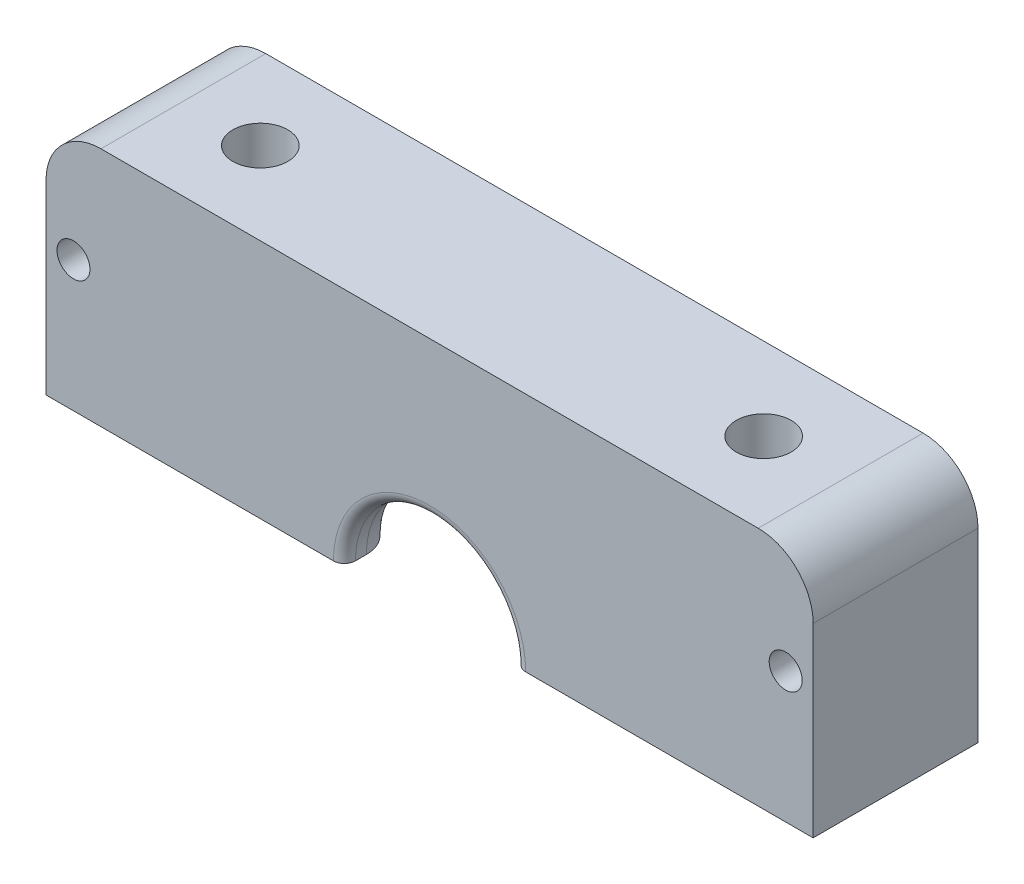
ISO-10303-21;
HEADER;
FILE_DESCRIPTION(('STEP AP214'),'2;1');
FILE_NAME('part.step','',(''),(''),'','','');
FILE_SCHEMA(('AUTOMOTIVE_DESIGN { 1 0 10303 214 1 1 1 1 }'));
ENDSEC;
DATA;
#1=APPLICATION_CONTEXT('core data for automotive mechanical design processes');
#2=APPLICATION_PROTOCOL_DEFINITION('international standard','automotive_design',2000,#1);
#3=PRODUCT_CONTEXT('',#1,'mechanical');
#4=PRODUCT('Part','Part','',(#3));
#5=PRODUCT_RELATED_PRODUCT_CATEGORY('part','',(#4));
#6=PRODUCT_DEFINITION_FORMATION('','',#4);
#7=PRODUCT_DEFINITION_CONTEXT('part definition',#1,'design');
#8=PRODUCT_DEFINITION('design','',#6,#7);
#9=PRODUCT_DEFINITION_SHAPE('','',#8);
#10=(LENGTH_UNIT() NAMED_UNIT(*) SI_UNIT(.MILLI.,.METRE.));
#11=(NAMED_UNIT(*) PLANE_ANGLE_UNIT() SI_UNIT($,.RADIAN.));
#12=(NAMED_UNIT(*) SI_UNIT($,.STERADIAN.) SOLID_ANGLE_UNIT());
#13=UNCERTAINTY_MEASURE_WITH_UNIT(LENGTH_MEASURE(1.E-05),#10,'distance_accuracy_value','');
#14=(GEOMETRIC_REPRESENTATION_CONTEXT(3) GLOBAL_UNCERTAINTY_ASSIGNED_CONTEXT((#13)) GLOBAL_UNIT_ASSIGNED_CONTEXT((#10,
#11,#12)) REPRESENTATION_CONTEXT('',''));
#15=CARTESIAN_POINT('',(0.,0.,0.));
#16=DIRECTION('',(0.,0.,1.));
#17=DIRECTION('',(1.,0.,0.));
#18=AXIS2_PLACEMENT_3D('',#15,#16,#17);
#19=CARTESIAN_POINT('',(34.9,16.9,15.));
#20=DIRECTION('',(-1.,0.,0.));
#21=DIRECTION('',(0.,-1.,0.));
#22=AXIS2_PLACEMENT_3D('',#19,#20,#21);
#23=PLANE('',#22);
#24=DIRECTION('',(0.,1.,0.));
#25=VECTOR('',#24,1.);
#26=CARTESIAN_POINT('',(34.9,16.9,15.));
#27=LINE('',#26,#25);
#28=CARTESIAN_POINT('',(34.9,0.,15.));
#29=VERTEX_POINT('',#28);
#30=CARTESIAN_POINT('',(34.9,16.9,15.));
#31=VERTEX_POINT('',#30);
#32=EDGE_CURVE('E153',#29,#31,#27,.T.);
#33=ORIENTED_EDGE('',*,*,#32,.F.);
#34=DIRECTION('',(0.,0.,-1.));
#35=VECTOR('',#34,1.);
#36=CARTESIAN_POINT('',(34.9,0.,15.));
#37=LINE('',#36,#35);
#38=CARTESIAN_POINT('',(34.9,0.,0.));
#39=VERTEX_POINT('',#38);
#40=EDGE_CURVE('E135',#29,#39,#37,.T.);
#41=ORIENTED_EDGE('',*,*,#40,.T.);
#42=DIRECTION('',(0.,1.,0.));
#43=VECTOR('',#42,1.);
#44=CARTESIAN_POINT('',(34.9,16.9,0.));
#45=LINE('',#44,#43);
#46=CARTESIAN_POINT('',(34.9,16.9,0.));
#47=VERTEX_POINT('',#46);
#48=EDGE_CURVE('E181',#39,#47,#45,.T.);
#49=ORIENTED_EDGE('',*,*,#48,.T.);
#50=DIRECTION('',(0.,0.,-1.));
#51=VECTOR('',#50,1.);
#52=CARTESIAN_POINT('',(34.9,16.9,15.));
#53=LINE('',#52,#51);
#54=EDGE_CURVE('E160',#31,#47,#53,.T.);
#55=ORIENTED_EDGE('',*,*,#54,.F.);
#56=EDGE_LOOP('',(#33,#41,#49,#55));
#57=FACE_BOUND('',#56,.T.);
#58=ADVANCED_FACE('F37',(#57),#23,.F.);
#59=CARTESIAN_POINT('',(29.9,16.9,15.));
#60=DIRECTION('',(0.,0.,-1.));
#61=DIRECTION('',(-1.,0.,0.));
#62=AXIS2_PLACEMENT_3D('',#59,#60,#61);
#63=CYLINDRICAL_SURFACE('',#62,5.);
#64=CARTESIAN_POINT('',(29.9,16.9,0.));
#65=DIRECTION('',(0.,0.,1.));
#66=DIRECTION('',(-1.,0.,0.));
#67=AXIS2_PLACEMENT_3D('',#64,#65,#66);
#68=CIRCLE('',#67,5.);
#69=CARTESIAN_POINT('',(29.9,21.9,0.));
#70=VERTEX_POINT('',#69);
#71=EDGE_CURVE('E183',#47,#70,#68,.T.);
#72=ORIENTED_EDGE('',*,*,#71,.T.);
#73=DIRECTION('',(0.,0.,-1.));
#74=VECTOR('',#73,1.);
#75=CARTESIAN_POINT('',(29.9,21.9,15.));
#76=LINE('',#75,#74);
#77=CARTESIAN_POINT('',(29.9,21.9,15.));
#78=VERTEX_POINT('',#77);
#79=EDGE_CURVE('E194',#78,#70,#76,.T.);
#80=ORIENTED_EDGE('',*,*,#79,.F.);
#81=CARTESIAN_POINT('',(29.9,16.9,15.));
#82=DIRECTION('',(0.,0.,1.));
#83=DIRECTION('',(-1.,0.,0.));
#84=AXIS2_PLACEMENT_3D('',#81,#82,#83);
#85=CIRCLE('',#84,5.);
#86=EDGE_CURVE('E162',#31,#78,#85,.T.);
#87=ORIENTED_EDGE('',*,*,#86,.F.);
#88=ORIENTED_EDGE('',*,*,#54,.T.);
#89=EDGE_LOOP('',(#72,#80,#87,#88));
#90=FACE_BOUND('',#89,.T.);
#91=ADVANCED_FACE('F257',(#90),#63,.T.);
#92=CARTESIAN_POINT('',(-29.9,21.9,15.));
#93=DIRECTION('',(0.,-1.,0.));
#94=DIRECTION('',(0.,0.,-1.));
#95=AXIS2_PLACEMENT_3D('',#92,#93,#94);
#96=PLANE('',#95);
#97=CARTESIAN_POINT('',(-22.9,21.9,7.5));
#98=DIRECTION('',(0.,1.,0.));
#99=DIRECTION('',(0.,0.,1.));
#100=AXIS2_PLACEMENT_3D('',#97,#98,#99);
#101=CIRCLE('',#100,2.5);
#102=CARTESIAN_POINT('',(-22.9,21.9,10.));
#103=VERTEX_POINT('',#102);
#104=EDGE_CURVE('E333',#103,#103,#101,.T.);
#105=ORIENTED_EDGE('',*,*,#104,.F.);
#106=EDGE_LOOP('',(#105));
#107=FACE_BOUND('',#106,.T.);
#108=CARTESIAN_POINT('',(22.9,21.9,7.50000000000011));
#109=DIRECTION('',(0.,1.,0.));
#110=DIRECTION('',(0.,0.,-1.));
#111=AXIS2_PLACEMENT_3D('',#108,#109,#110);
#112=CIRCLE('',#111,2.5);
#113=CARTESIAN_POINT('',(22.9,21.9,5.0000000000001));
#114=VERTEX_POINT('',#113);
#115=EDGE_CURVE('E337',#114,#114,#112,.T.);
#116=ORIENTED_EDGE('',*,*,#115,.F.);
#117=EDGE_LOOP('',(#116));
#118=FACE_BOUND('',#117,.T.);
#119=DIRECTION('',(-1.,0.,0.));
#120=VECTOR('',#119,1.);
#121=CARTESIAN_POINT('',(-29.9,21.9,0.));
#122=LINE('',#121,#120);
#123=CARTESIAN_POINT('',(-29.9,21.9,0.));
#124=VERTEX_POINT('',#123);
#125=EDGE_CURVE('E186',#70,#124,#122,.T.);
#126=ORIENTED_EDGE('',*,*,#125,.T.);
#127=DIRECTION('',(0.,0.,-1.));
#128=VECTOR('',#127,1.);
#129=CARTESIAN_POINT('',(-29.9,21.9,15.));
#130=LINE('',#129,#128);
#131=CARTESIAN_POINT('',(-29.9,21.9,15.));
#132=VERTEX_POINT('',#131);
#133=EDGE_CURVE('E191',#132,#124,#130,.T.);
#134=ORIENTED_EDGE('',*,*,#133,.F.);
#135=DIRECTION('',(-1.,0.,0.));
#136=VECTOR('',#135,1.);
#137=CARTESIAN_POINT('',(-29.9,21.9,15.));
#138=LINE('',#137,#136);
#139=EDGE_CURVE('E165',#78,#132,#138,.T.);
#140=ORIENTED_EDGE('',*,*,#139,.F.);
#141=ORIENTED_EDGE('',*,*,#79,.T.);
#142=EDGE_LOOP('',(#126,#134,#140,#141));
#143=FACE_BOUND('',#142,.T.);
#144=ADVANCED_FACE('F262',(#107,#118,#143),#96,.F.);
#145=CARTESIAN_POINT('',(-29.9,16.9,15.));
#146=DIRECTION('',(0.,0.,-1.));
#147=DIRECTION('',(-1.,0.,0.));
#148=AXIS2_PLACEMENT_3D('',#145,#146,#147);
#149=CYLINDRICAL_SURFACE('',#148,5.);
#150=CARTESIAN_POINT('',(-29.9,16.9,0.));
#151=DIRECTION('',(0.,0.,1.));
#152=DIRECTION('',(1.,0.,0.));
#153=AXIS2_PLACEMENT_3D('',#150,#151,#152);
#154=CIRCLE('',#153,5.);
#155=CARTESIAN_POINT('',(-34.9,16.9,0.));
#156=VERTEX_POINT('',#155);
#157=EDGE_CURVE('E168',#124,#156,#154,.T.);
#158=ORIENTED_EDGE('',*,*,#157,.T.);
#159=DIRECTION('',(0.,0.,-1.));
#160=VECTOR('',#159,1.);
#161=CARTESIAN_POINT('',(-34.9,16.9,15.));
#162=LINE('',#161,#160);
#163=CARTESIAN_POINT('',(-34.9,16.9,15.));
#164=VERTEX_POINT('',#163);
#165=EDGE_CURVE('E180',#164,#156,#162,.T.);
#166=ORIENTED_EDGE('',*,*,#165,.F.);
#167=CARTESIAN_POINT('',(-29.9,16.9,15.));
#168=DIRECTION('',(0.,0.,1.));
#169=DIRECTION('',(1.,0.,0.));
#170=AXIS2_PLACEMENT_3D('',#167,#168,#169);
#171=CIRCLE('',#170,5.);
#172=EDGE_CURVE('E175',#132,#164,#171,.T.);
#173=ORIENTED_EDGE('',*,*,#172,.F.);
#174=ORIENTED_EDGE('',*,*,#133,.T.);
#175=EDGE_LOOP('',(#158,#166,#173,#174));
#176=FACE_BOUND('',#175,.T.);
#177=ADVANCED_FACE('F318',(#176),#149,.T.);
#178=CARTESIAN_POINT('',(-34.9,16.9,15.));
#179=DIRECTION('',(1.,0.,0.));
#180=DIRECTION('',(0.,1.,0.));
#181=AXIS2_PLACEMENT_3D('',#178,#179,#180);
#182=PLANE('',#181);
#183=DIRECTION('',(0.,-1.,0.));
#184=VECTOR('',#183,1.);
#185=CARTESIAN_POINT('',(-34.9,16.9,0.));
#186=LINE('',#185,#184);
#187=CARTESIAN_POINT('',(-34.9,0.,0.));
#188=VERTEX_POINT('',#187);
#189=EDGE_CURVE('E163',#156,#188,#186,.T.);
#190=ORIENTED_EDGE('',*,*,#189,.T.);
#191=DIRECTION('',(0.,0.,1.));
#192=VECTOR('',#191,1.);
#193=CARTESIAN_POINT('',(-34.9,0.,15.));
#194=LINE('',#193,#192);
#195=CARTESIAN_POINT('',(-34.9,0.,15.));
#196=VERTEX_POINT('',#195);
#197=EDGE_CURVE('E147',#188,#196,#194,.T.);
#198=ORIENTED_EDGE('',*,*,#197,.T.);
#199=DIRECTION('',(0.,-1.,0.));
#200=VECTOR('',#199,1.);
#201=CARTESIAN_POINT('',(-34.9,16.9,15.));
#202=LINE('',#201,#200);
#203=EDGE_CURVE('E177',#164,#196,#202,.T.);
#204=ORIENTED_EDGE('',*,*,#203,.F.);
#205=ORIENTED_EDGE('',*,*,#165,.T.);
#206=EDGE_LOOP('',(#190,#198,#204,#205));
#207=FACE_BOUND('',#206,.T.);
#208=ADVANCED_FACE('F310',(#207),#182,.F.);
#209=CARTESIAN_POINT('',(-29.9,-16.9,15.));
#210=DIRECTION('',(0.,0.,1.));
#211=DIRECTION('',(1.,0.,0.));
#212=AXIS2_PLACEMENT_3D('',#209,#210,#211);
#213=PLANE('',#212);
#214=DIRECTION('',(-1.,0.,0.));
#215=VECTOR('',#214,1.);
#216=CARTESIAN_POINT('',(-43.4263275089978,0.,15.));
#217=LINE('',#216,#215);
#218=CARTESIAN_POINT('',(-8.75,0.,15.));
#219=VERTEX_POINT('',#218);
#220=EDGE_CURVE('E157',#219,#196,#217,.T.);
#221=ORIENTED_EDGE('',*,*,#220,.F.);
#222=CARTESIAN_POINT('',(0.,0.,15.));
#223=DIRECTION('',(0.,0.,1.));
#224=DIRECTION('',(1.,0.,0.));
#225=AXIS2_PLACEMENT_3D('',#222,#223,#224);
#226=CIRCLE('',#225,8.75);
#227=CARTESIAN_POINT('',(8.75,0.,15.));
#228=VERTEX_POINT('',#227);
#229=EDGE_CURVE('E156',#219,#228,#226,.F.);
#230=ORIENTED_EDGE('',*,*,#229,.T.);
#231=EDGE_CURVE('E139',#29,#228,#217,.T.);
#232=ORIENTED_EDGE('',*,*,#231,.F.);
#233=ORIENTED_EDGE('',*,*,#32,.T.);
#234=ORIENTED_EDGE('',*,*,#86,.T.);
#235=ORIENTED_EDGE('',*,*,#139,.T.);
#236=ORIENTED_EDGE('',*,*,#172,.T.);
#237=ORIENTED_EDGE('',*,*,#203,.T.);
#238=EDGE_LOOP('',(#221,#230,#232,#233,#234,#235,#236,#237));
#239=FACE_BOUND('',#238,.T.);
#240=CARTESIAN_POINT('',(32.4,11.9,15.));
#241=DIRECTION('',(0.,0.,1.));
#242=DIRECTION('',(-1.,0.,0.));
#243=AXIS2_PLACEMENT_3D('',#240,#241,#242);
#244=CIRCLE('',#243,1.5);
#245=CARTESIAN_POINT('',(30.9,11.9,15.));
#246=VERTEX_POINT('',#245);
#247=EDGE_CURVE('E296',#246,#246,#244,.T.);
#248=ORIENTED_EDGE('',*,*,#247,.F.);
#249=EDGE_LOOP('',(#248));
#250=FACE_BOUND('',#249,.T.);
#251=CARTESIAN_POINT('',(-32.4,11.9,15.));
#252=DIRECTION('',(0.,0.,1.));
#253=DIRECTION('',(1.,0.,0.));
#254=AXIS2_PLACEMENT_3D('',#251,#252,#253);
#255=CIRCLE('',#254,1.5);
#256=CARTESIAN_POINT('',(-30.9,11.9,15.));
#257=VERTEX_POINT('',#256);
#258=EDGE_CURVE('E171',#257,#257,#255,.T.);
#259=ORIENTED_EDGE('',*,*,#258,.F.);
#260=EDGE_LOOP('',(#259));
#261=FACE_BOUND('',#260,.T.);
#262=ADVANCED_FACE('F151',(#239,#250,#261),#213,.T.);
#263=CARTESIAN_POINT('',(-29.9,-16.9,0.));
#264=DIRECTION('',(0.,0.,1.));
#265=DIRECTION('',(1.,0.,0.));
#266=AXIS2_PLACEMENT_3D('',#263,#264,#265);
#267=PLANE('',#266);
#268=CARTESIAN_POINT('',(32.4,11.9,0.));
#269=DIRECTION('',(0.,0.,1.));
#270=DIRECTION('',(-1.,0.,0.));
#271=AXIS2_PLACEMENT_3D('',#268,#269,#270);
#272=CIRCLE('',#271,1.5);
#273=CARTESIAN_POINT('',(30.9,11.9,0.));
#274=VERTEX_POINT('',#273);
#275=EDGE_CURVE('E146',#274,#274,#272,.T.);
#276=ORIENTED_EDGE('',*,*,#275,.T.);
#277=EDGE_LOOP('',(#276));
#278=FACE_BOUND('',#277,.T.);
#279=CARTESIAN_POINT('',(-32.4,11.9,0.));
#280=DIRECTION('',(0.,0.,1.));
#281=DIRECTION('',(1.,0.,0.));
#282=AXIS2_PLACEMENT_3D('',#279,#280,#281);
#283=CIRCLE('',#282,1.5);
#284=CARTESIAN_POINT('',(-30.9,11.9,0.));
#285=VERTEX_POINT('',#284);
#286=EDGE_CURVE('E184',#285,#285,#283,.T.);
#287=ORIENTED_EDGE('',*,*,#286,.T.);
#288=EDGE_LOOP('',(#287));
#289=FACE_BOUND('',#288,.T.);
#290=ORIENTED_EDGE('',*,*,#48,.F.);
#291=DIRECTION('',(-1.,0.,0.));
#292=VECTOR('',#291,1.);
#293=CARTESIAN_POINT('',(-43.4263275089978,0.,0.));
#294=LINE('',#293,#292);
#295=EDGE_CURVE('E142',#39,#188,#294,.T.);
#296=ORIENTED_EDGE('',*,*,#295,.T.);
#297=ORIENTED_EDGE('',*,*,#189,.F.);
#298=ORIENTED_EDGE('',*,*,#157,.F.);
#299=ORIENTED_EDGE('',*,*,#125,.F.);
#300=ORIENTED_EDGE('',*,*,#71,.F.);
#301=EDGE_LOOP('',(#290,#296,#297,#298,#299,#300));
#302=FACE_BOUND('',#301,.T.);
#303=ADVANCED_FACE('F309',(#278,#289,#302),#267,.F.);
#304=CARTESIAN_POINT('',(-32.4,11.9,0.));
#305=DIRECTION('',(0.,0.,1.));
#306=DIRECTION('',(1.,0.,0.));
#307=AXIS2_PLACEMENT_3D('',#304,#305,#306);
#308=CYLINDRICAL_SURFACE('',#307,1.5);
#309=ORIENTED_EDGE('',*,*,#286,.F.);
#310=EDGE_LOOP('',(#309));
#311=FACE_BOUND('',#310,.T.);
#312=ORIENTED_EDGE('',*,*,#258,.T.);
#313=EDGE_LOOP('',(#312));
#314=FACE_BOUND('',#313,.T.);
#315=ADVANCED_FACE('F306',(#311,#314),#308,.F.);
#316=CARTESIAN_POINT('',(32.4,11.9,0.));
#317=DIRECTION('',(0.,0.,1.));
#318=DIRECTION('',(1.,0.,0.));
#319=AXIS2_PLACEMENT_3D('',#316,#317,#318);
#320=CYLINDRICAL_SURFACE('',#319,1.5);
#321=ORIENTED_EDGE('',*,*,#275,.F.);
#322=EDGE_LOOP('',(#321));
#323=FACE_BOUND('',#322,.T.);
#324=ORIENTED_EDGE('',*,*,#247,.T.);
#325=EDGE_LOOP('',(#324));
#326=FACE_BOUND('',#325,.T.);
#327=ADVANCED_FACE('F353',(#323,#326),#320,.F.);
#328=CARTESIAN_POINT('',(0.,0.,10.));
#329=DIRECTION('',(0.,0.,1.));
#330=DIRECTION('',(1.,0.,0.));
#331=AXIS2_PLACEMENT_3D('',#328,#329,#330);
#332=CYLINDRICAL_SURFACE('',#331,7.75);
#333=DIRECTION('',(0.,0.,1.));
#334=VECTOR('',#333,1.);
#335=CARTESIAN_POINT('',(-7.75,0.,10.));
#336=LINE('',#335,#334);
#337=CARTESIAN_POINT('',(-7.75,0.,14.));
#338=VERTEX_POINT('',#337);
#339=CARTESIAN_POINT('',(-7.75,0.,13.));
#340=VERTEX_POINT('',#339);
#341=EDGE_CURVE('E292',#338,#340,#336,.F.);
#342=ORIENTED_EDGE('',*,*,#341,.T.);
#343=CARTESIAN_POINT('',(0.,0.,13.));
#344=DIRECTION('',(0.,0.,-1.));
#345=DIRECTION('',(-1.,0.,0.));
#346=AXIS2_PLACEMENT_3D('',#343,#344,#345);
#347=CIRCLE('',#346,7.75);
#348=CARTESIAN_POINT('',(7.75,0.,13.));
#349=VERTEX_POINT('',#348);
#350=EDGE_CURVE('E11',#340,#349,#347,.T.);
#351=ORIENTED_EDGE('',*,*,#350,.T.);
#352=DIRECTION('',(0.,0.,1.));
#353=VECTOR('',#352,1.);
#354=CARTESIAN_POINT('',(7.75,0.,10.));
#355=LINE('',#354,#353);
#356=CARTESIAN_POINT('',(7.75,0.,14.));
#357=VERTEX_POINT('',#356);
#358=EDGE_CURVE('E238',#349,#357,#355,.T.);
#359=ORIENTED_EDGE('',*,*,#358,.T.);
#360=CARTESIAN_POINT('',(0.,0.,14.));
#361=DIRECTION('',(0.,0.,1.));
#362=DIRECTION('',(1.,0.,0.));
#363=AXIS2_PLACEMENT_3D('',#360,#361,#362);
#364=CIRCLE('',#363,7.75);
#365=EDGE_CURVE('E223',#357,#338,#364,.T.);
#366=ORIENTED_EDGE('',*,*,#365,.T.);
#367=EDGE_LOOP('',(#342,#351,#359,#366));
#368=FACE_BOUND('',#367,.T.);
#369=ADVANCED_FACE('F351',(#368),#332,.F.);
#370=CARTESIAN_POINT('',(-15.5,0.,10.));
#371=DIRECTION('',(0.,0.,-1.));
#372=DIRECTION('',(-1.,0.,0.));
#373=AXIS2_PLACEMENT_3D('',#370,#371,#372);
#374=PLANE('',#373);
#375=DIRECTION('',(1.,0.,0.));
#376=VECTOR('',#375,1.);
#377=CARTESIAN_POINT('',(-15.5,0.,10.));
#378=LINE('',#377,#376);
#379=CARTESIAN_POINT('',(10.75,0.,9.99999999999996));
#380=VERTEX_POINT('',#379);
#381=CARTESIAN_POINT('',(14.5,0.,9.99999999999995));
#382=VERTEX_POINT('',#381);
#383=EDGE_CURVE('E237',#380,#382,#378,.T.);
#384=ORIENTED_EDGE('',*,*,#383,.F.);
#385=CARTESIAN_POINT('',(0.,0.,9.99999999999998));
#386=DIRECTION('',(0.,0.,-1.));
#387=DIRECTION('',(-1.,0.,0.));
#388=AXIS2_PLACEMENT_3D('',#385,#386,#387);
#389=CIRCLE('',#388,10.75);
#390=CARTESIAN_POINT('',(-10.75,0.,10.));
#391=VERTEX_POINT('',#390);
#392=EDGE_CURVE('E231',#380,#391,#389,.F.);
#393=ORIENTED_EDGE('',*,*,#392,.T.);
#394=CARTESIAN_POINT('',(-14.5,0.,10.));
#395=VERTEX_POINT('',#394);
#396=EDGE_CURVE('E248',#395,#391,#378,.T.);
#397=ORIENTED_EDGE('',*,*,#396,.F.);
#398=CARTESIAN_POINT('',(0.,0.,9.99999999999998));
#399=DIRECTION('',(0.,0.,-1.));
#400=DIRECTION('',(-1.,0.,0.));
#401=AXIS2_PLACEMENT_3D('',#398,#399,#400);
#402=CIRCLE('',#401,14.5);
#403=EDGE_CURVE('E212',#395,#382,#402,.T.);
#404=ORIENTED_EDGE('',*,*,#403,.T.);
#405=EDGE_LOOP('',(#384,#393,#397,#404));
#406=FACE_BOUND('',#405,.T.);
#407=ADVANCED_FACE('F242',(#406),#374,.T.);
#408=CARTESIAN_POINT('',(0.,0.,4.49999999999998));
#409=DIRECTION('',(0.,0.,1.));
#410=DIRECTION('',(1.,0.,0.));
#411=AXIS2_PLACEMENT_3D('',#408,#409,#410);
#412=PLANE('',#411);
#413=DIRECTION('',(-1.,0.,0.));
#414=VECTOR('',#413,1.);
#415=CARTESIAN_POINT('',(0.,0.,4.49999999999998));
#416=LINE('',#415,#414);
#417=CARTESIAN_POINT('',(14.5,0.,4.49999999999995));
#418=VERTEX_POINT('',#417);
#419=CARTESIAN_POINT('',(-14.5,0.,4.50000000000001));
#420=VERTEX_POINT('',#419);
#421=EDGE_CURVE('E246',#418,#420,#416,.T.);
#422=ORIENTED_EDGE('',*,*,#421,.F.);
#423=CARTESIAN_POINT('',(0.,0.,4.49999999999998));
#424=DIRECTION('',(0.,0.,1.));
#425=DIRECTION('',(1.,0.,0.));
#426=AXIS2_PLACEMENT_3D('',#423,#424,#425);
#427=CIRCLE('',#426,14.5);
#428=EDGE_CURVE('E204',#418,#420,#427,.T.);
#429=ORIENTED_EDGE('',*,*,#428,.T.);
#430=EDGE_LOOP('',(#422,#429));
#431=FACE_BOUND('',#430,.T.);
#432=ADVANCED_FACE('F287',(#431),#412,.T.);
#433=CARTESIAN_POINT('',(0.,0.,15.));
#434=DIRECTION('',(0.,0.,1.));
#435=DIRECTION('',(1.,0.,0.));
#436=AXIS2_PLACEMENT_3D('',#433,#434,#435);
#437=CYLINDRICAL_SURFACE('',#436,15.5);
#438=DIRECTION('',(0.,0.,1.));
#439=VECTOR('',#438,1.);
#440=CARTESIAN_POINT('',(-15.5,0.,15.));
#441=LINE('',#440,#439);
#442=CARTESIAN_POINT('',(-15.5,0.,5.50000000000002));
#443=VERTEX_POINT('',#442);
#444=CARTESIAN_POINT('',(-15.5,0.,9.00000000000002));
#445=VERTEX_POINT('',#444);
#446=EDGE_CURVE('E201',#443,#445,#441,.T.);
#447=ORIENTED_EDGE('',*,*,#446,.F.);
#448=CARTESIAN_POINT('',(0.,0.,5.49999999999998));
#449=DIRECTION('',(0.,0.,1.));
#450=DIRECTION('',(1.,0.,0.));
#451=AXIS2_PLACEMENT_3D('',#448,#449,#450);
#452=CIRCLE('',#451,15.5);
#453=CARTESIAN_POINT('',(15.5,0.,5.49999999999994));
#454=VERTEX_POINT('',#453);
#455=EDGE_CURVE('E210',#443,#454,#452,.F.);
#456=ORIENTED_EDGE('',*,*,#455,.T.);
#457=DIRECTION('',(0.,0.,1.));
#458=VECTOR('',#457,1.);
#459=CARTESIAN_POINT('',(15.5,0.,15.));
#460=LINE('',#459,#458);
#461=CARTESIAN_POINT('',(15.5,0.,8.99999999999994));
#462=VERTEX_POINT('',#461);
#463=EDGE_CURVE('E198',#462,#454,#460,.F.);
#464=ORIENTED_EDGE('',*,*,#463,.F.);
#465=CARTESIAN_POINT('',(0.,0.,8.99999999999998));
#466=DIRECTION('',(0.,0.,-1.));
#467=DIRECTION('',(-1.,0.,0.));
#468=AXIS2_PLACEMENT_3D('',#465,#466,#467);
#469=CIRCLE('',#468,15.5);
#470=EDGE_CURVE('E207',#462,#445,#469,.F.);
#471=ORIENTED_EDGE('',*,*,#470,.T.);
#472=EDGE_LOOP('',(#447,#456,#464,#471));
#473=FACE_BOUND('',#472,.T.);
#474=ADVANCED_FACE('F281',(#473),#437,.F.);
#475=CARTESIAN_POINT('',(-43.4263275089978,0.,0.));
#476=DIRECTION('',(0.,1.,0.));
#477=DIRECTION('',(0.,0.,1.));
#478=AXIS2_PLACEMENT_3D('',#475,#476,#477);
#479=PLANE('',#478);
#480=CARTESIAN_POINT('',(-22.9,0.,7.5));
#481=DIRECTION('',(0.,1.,0.));
#482=DIRECTION('',(0.,0.,1.));
#483=AXIS2_PLACEMENT_3D('',#480,#481,#482);
#484=CIRCLE('',#483,2.5);
#485=CARTESIAN_POINT('',(-22.9,0.,10.));
#486=VERTEX_POINT('',#485);
#487=EDGE_CURVE('E349',#486,#486,#484,.T.);
#488=ORIENTED_EDGE('',*,*,#487,.T.);
#489=EDGE_LOOP('',(#488));
#490=FACE_BOUND('',#489,.T.);
#491=CARTESIAN_POINT('',(22.9,0.,7.50000000000011));
#492=DIRECTION('',(0.,1.,0.));
#493=DIRECTION('',(0.,0.,-1.));
#494=AXIS2_PLACEMENT_3D('',#491,#492,#493);
#495=CIRCLE('',#494,2.5);
#496=CARTESIAN_POINT('',(22.9,0.,5.0000000000001));
#497=VERTEX_POINT('',#496);
#498=EDGE_CURVE('E382',#497,#497,#495,.T.);
#499=ORIENTED_EDGE('',*,*,#498,.T.);
#500=EDGE_LOOP('',(#499));
#501=FACE_BOUND('',#500,.T.);
#502=ORIENTED_EDGE('',*,*,#396,.T.);
#503=CARTESIAN_POINT('',(-10.75,0.,13.));
#504=DIRECTION('',(0.,1.,0.));
#505=DIRECTION('',(0.,0.,1.));
#506=AXIS2_PLACEMENT_3D('',#503,#504,#505);
#507=CIRCLE('',#506,3.);
#508=EDGE_CURVE('E45',#391,#340,#507,.F.);
#509=ORIENTED_EDGE('',*,*,#508,.T.);
#510=ORIENTED_EDGE('',*,*,#341,.F.);
#511=CARTESIAN_POINT('',(-8.75,0.,14.));
#512=DIRECTION('',(0.,1.,0.));
#513=DIRECTION('',(0.,0.,1.));
#514=AXIS2_PLACEMENT_3D('',#511,#512,#513);
#515=CIRCLE('',#514,1.);
#516=EDGE_CURVE('E228',#338,#219,#515,.F.);
#517=ORIENTED_EDGE('',*,*,#516,.T.);
#518=ORIENTED_EDGE('',*,*,#220,.T.);
#519=ORIENTED_EDGE('',*,*,#197,.F.);
#520=ORIENTED_EDGE('',*,*,#295,.F.);
#521=ORIENTED_EDGE('',*,*,#40,.F.);
#522=ORIENTED_EDGE('',*,*,#231,.T.);
#523=CARTESIAN_POINT('',(8.75,0.,14.));
#524=DIRECTION('',(0.,1.,0.));
#525=DIRECTION('',(0.,0.,1.));
#526=AXIS2_PLACEMENT_3D('',#523,#524,#525);
#527=CIRCLE('',#526,1.);
#528=EDGE_CURVE('E226',#228,#357,#527,.F.);
#529=ORIENTED_EDGE('',*,*,#528,.T.);
#530=ORIENTED_EDGE('',*,*,#358,.F.);
#531=CARTESIAN_POINT('',(10.75,0.,13.));
#532=DIRECTION('',(0.,1.,0.));
#533=DIRECTION('',(0.,0.,1.));
#534=AXIS2_PLACEMENT_3D('',#531,#532,#533);
#535=CIRCLE('',#534,3.);
#536=EDGE_CURVE('E234',#349,#380,#535,.F.);
#537=ORIENTED_EDGE('',*,*,#536,.T.);
#538=ORIENTED_EDGE('',*,*,#383,.T.);
#539=CARTESIAN_POINT('',(14.5,0.,8.99999999999995));
#540=DIRECTION('',(0.,1.,0.));
#541=DIRECTION('',(0.,0.,1.));
#542=AXIS2_PLACEMENT_3D('',#539,#540,#541);
#543=CIRCLE('',#542,1.);
#544=EDGE_CURVE('E221',#382,#462,#543,.T.);
#545=ORIENTED_EDGE('',*,*,#544,.T.);
#546=ORIENTED_EDGE('',*,*,#463,.T.);
#547=CARTESIAN_POINT('',(14.5,0.,5.49999999999995));
#548=DIRECTION('',(0.,1.,0.));
#549=DIRECTION('',(0.,0.,1.));
#550=AXIS2_PLACEMENT_3D('',#547,#548,#549);
#551=CIRCLE('',#550,1.);
#552=EDGE_CURVE('E217',#454,#418,#551,.T.);
#553=ORIENTED_EDGE('',*,*,#552,.T.);
#554=ORIENTED_EDGE('',*,*,#421,.T.);
#555=CARTESIAN_POINT('',(-14.5,0.,5.50000000000001));
#556=DIRECTION('',(0.,1.,0.));
#557=DIRECTION('',(0.,0.,1.));
#558=AXIS2_PLACEMENT_3D('',#555,#556,#557);
#559=CIRCLE('',#558,1.);
#560=EDGE_CURVE('E215',#420,#443,#559,.T.);
#561=ORIENTED_EDGE('',*,*,#560,.T.);
#562=ORIENTED_EDGE('',*,*,#446,.T.);
#563=CARTESIAN_POINT('',(-14.5,0.,9.00000000000001));
#564=DIRECTION('',(0.,1.,0.));
#565=DIRECTION('',(0.,0.,1.));
#566=AXIS2_PLACEMENT_3D('',#563,#564,#565);
#567=CIRCLE('',#566,1.);
#568=EDGE_CURVE('E219',#445,#395,#567,.T.);
#569=ORIENTED_EDGE('',*,*,#568,.T.);
#570=EDGE_LOOP('',(#502,#509,#510,#517,#518,#519,#520,#521,#522,#529,#530,#537,#538,#545,#546,
#553,#554,#561,#562,#569));
#571=FACE_BOUND('',#570,.T.);
#572=ADVANCED_FACE('F137',(#490,#501,#571),#479,.F.);
#573=CARTESIAN_POINT('',(22.9,0.,7.50000000000011));
#574=DIRECTION('',(0.,1.,0.));
#575=DIRECTION('',(0.,0.,1.));
#576=AXIS2_PLACEMENT_3D('',#573,#574,#575);
#577=CYLINDRICAL_SURFACE('',#576,2.5);
#578=ORIENTED_EDGE('',*,*,#498,.F.);
#579=EDGE_LOOP('',(#578));
#580=FACE_BOUND('',#579,.T.);
#581=ORIENTED_EDGE('',*,*,#115,.T.);
#582=EDGE_LOOP('',(#581));
#583=FACE_BOUND('',#582,.T.);
#584=ADVANCED_FACE('F368',(#580,#583),#577,.F.);
#585=CARTESIAN_POINT('',(-22.9,0.,7.5));
#586=DIRECTION('',(0.,1.,0.));
#587=DIRECTION('',(0.,0.,1.));
#588=AXIS2_PLACEMENT_3D('',#585,#586,#587);
#589=CYLINDRICAL_SURFACE('',#588,2.5);
#590=ORIENTED_EDGE('',*,*,#487,.F.);
#591=EDGE_LOOP('',(#590));
#592=FACE_BOUND('',#591,.T.);
#593=ORIENTED_EDGE('',*,*,#104,.T.);
#594=EDGE_LOOP('',(#593));
#595=FACE_BOUND('',#594,.T.);
#596=ADVANCED_FACE('F270',(#592,#595),#589,.F.);
#597=CARTESIAN_POINT('',(0.,0.,5.49999999999998));
#598=DIRECTION('',(0.,0.,1.));
#599=DIRECTION('',(1.,0.,0.));
#600=AXIS2_PLACEMENT_3D('',#597,#598,#599);
#601=TOROIDAL_SURFACE('',#600,14.5,1.);
#602=ORIENTED_EDGE('',*,*,#552,.F.);
#603=ORIENTED_EDGE('',*,*,#455,.F.);
#604=ORIENTED_EDGE('',*,*,#560,.F.);
#605=ORIENTED_EDGE('',*,*,#428,.F.);
#606=EDGE_LOOP('',(#602,#603,#604,#605));
#607=FACE_BOUND('',#606,.T.);
#608=ADVANCED_FACE('F267',(#607),#601,.F.);
#609=CARTESIAN_POINT('',(0.,0.,8.99999999999998));
#610=DIRECTION('',(0.,0.,-1.));
#611=DIRECTION('',(-1.,0.,0.));
#612=AXIS2_PLACEMENT_3D('',#609,#610,#611);
#613=TOROIDAL_SURFACE('',#612,14.5,1.);
#614=ORIENTED_EDGE('',*,*,#544,.F.);
#615=ORIENTED_EDGE('',*,*,#403,.F.);
#616=ORIENTED_EDGE('',*,*,#568,.F.);
#617=ORIENTED_EDGE('',*,*,#470,.F.);
#618=EDGE_LOOP('',(#614,#615,#616,#617));
#619=FACE_BOUND('',#618,.T.);
#620=ADVANCED_FACE('F254',(#619),#613,.F.);
#621=CARTESIAN_POINT('',(0.,0.,14.));
#622=DIRECTION('',(0.,0.,1.));
#623=DIRECTION('',(1.,0.,0.));
#624=AXIS2_PLACEMENT_3D('',#621,#622,#623);
#625=TOROIDAL_SURFACE('',#624,8.75,1.);
#626=ORIENTED_EDGE('',*,*,#528,.F.);
#627=ORIENTED_EDGE('',*,*,#229,.F.);
#628=ORIENTED_EDGE('',*,*,#516,.F.);
#629=ORIENTED_EDGE('',*,*,#365,.F.);
#630=EDGE_LOOP('',(#626,#627,#628,#629));
#631=FACE_BOUND('',#630,.T.);
#632=ADVANCED_FACE('F250',(#631),#625,.T.);
#633=CARTESIAN_POINT('',(0.,0.,13.));
#634=DIRECTION('',(0.,0.,-1.));
#635=DIRECTION('',(-1.,0.,0.));
#636=AXIS2_PLACEMENT_3D('',#633,#634,#635);
#637=TOROIDAL_SURFACE('',#636,10.75,3.);
#638=ORIENTED_EDGE('',*,*,#536,.F.);
#639=ORIENTED_EDGE('',*,*,#350,.F.);
#640=ORIENTED_EDGE('',*,*,#508,.F.);
#641=ORIENTED_EDGE('',*,*,#392,.F.);
#642=EDGE_LOOP('',(#638,#639,#640,#641));
#643=FACE_BOUND('',#642,.T.);
#644=ADVANCED_FACE('F39',(#643),#637,.T.);
#645=CLOSED_SHELL('',(#58,#91,#144,#177,#208,#262,#303,#315,#327,#369,#407,#432,#474,#572,#584,
#596,#608,#620,#632,#644));
#646=MANIFOLD_SOLID_BREP('B2',#645);
#647=ADVANCED_BREP_SHAPE_REPRESENTATION('',(#18,#646),#14);
#648=SHAPE_DEFINITION_REPRESENTATION(#9,#647);
ENDSEC;
END-ISO-10303-21;
